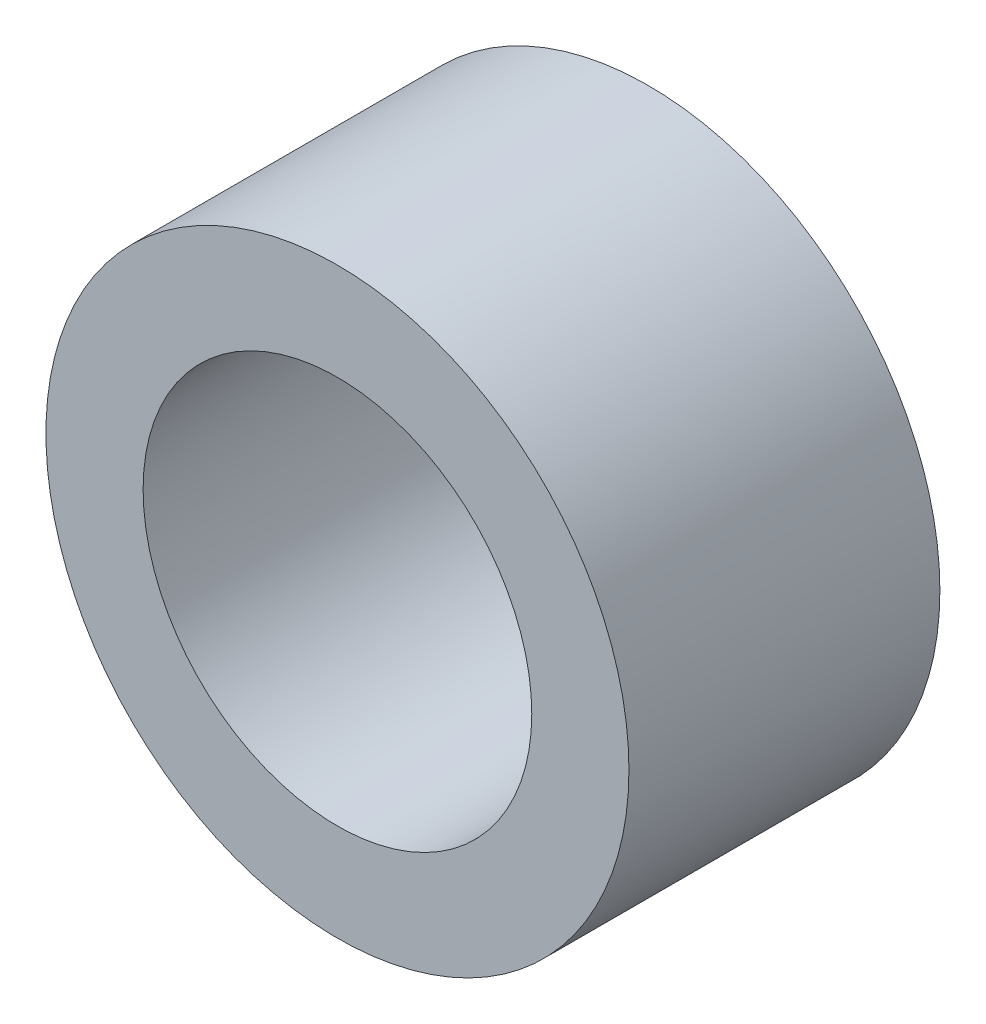
ISO-10303-21;
HEADER;
FILE_DESCRIPTION(('STEP AP214'),'2;1');
FILE_NAME('part.step','',(''),(''),'','','');
FILE_SCHEMA(('AUTOMOTIVE_DESIGN { 1 0 10303 214 1 1 1 1 }'));
ENDSEC;
DATA;
#1=APPLICATION_CONTEXT('core data for automotive mechanical design processes');
#2=APPLICATION_PROTOCOL_DEFINITION('international standard','automotive_design',2000,#1);
#3=PRODUCT_CONTEXT('',#1,'mechanical');
#4=PRODUCT('Part','Part','',(#3));
#5=PRODUCT_RELATED_PRODUCT_CATEGORY('part','',(#4));
#6=PRODUCT_DEFINITION_FORMATION('','',#4);
#7=PRODUCT_DEFINITION_CONTEXT('part definition',#1,'design');
#8=PRODUCT_DEFINITION('design','',#6,#7);
#9=PRODUCT_DEFINITION_SHAPE('','',#8);
#10=(LENGTH_UNIT() NAMED_UNIT(*) SI_UNIT(.MILLI.,.METRE.));
#11=(NAMED_UNIT(*) PLANE_ANGLE_UNIT() SI_UNIT($,.RADIAN.));
#12=(NAMED_UNIT(*) SI_UNIT($,.STERADIAN.) SOLID_ANGLE_UNIT());
#13=UNCERTAINTY_MEASURE_WITH_UNIT(LENGTH_MEASURE(1.E-05),#10,'distance_accuracy_value','');
#14=(GEOMETRIC_REPRESENTATION_CONTEXT(3) GLOBAL_UNCERTAINTY_ASSIGNED_CONTEXT((#13)) GLOBAL_UNIT_ASSIGNED_CONTEXT((#10,
#11,#12)) REPRESENTATION_CONTEXT('',''));
#15=CARTESIAN_POINT('',(0.,0.,0.));
#16=DIRECTION('',(0.,0.,1.));
#17=DIRECTION('',(1.,0.,0.));
#18=AXIS2_PLACEMENT_3D('',#15,#16,#17);
#19=CARTESIAN_POINT('',(0.,0.,16.));
#20=DIRECTION('',(0.,0.,1.));
#21=DIRECTION('',(1.,0.,0.));
#22=AXIS2_PLACEMENT_3D('',#19,#20,#21);
#23=PLANE('',#22);
#24=CARTESIAN_POINT('',(0.,0.,16.));
#25=DIRECTION('',(0.,0.,1.));
#26=DIRECTION('',(1.,0.,0.));
#27=AXIS2_PLACEMENT_3D('',#24,#25,#26);
#28=CIRCLE('',#27,30.);
#29=CARTESIAN_POINT('',(30.,0.,16.));
#30=VERTEX_POINT('',#29);
#31=EDGE_CURVE('E10',#30,#30,#28,.T.);
#32=ORIENTED_EDGE('',*,*,#31,.T.);
#33=EDGE_LOOP('',(#32));
#34=FACE_BOUND('',#33,.T.);
#35=CARTESIAN_POINT('',(0.,0.,16.));
#36=DIRECTION('',(0.,0.,1.));
#37=DIRECTION('',(1.,0.,0.));
#38=AXIS2_PLACEMENT_3D('',#35,#36,#37);
#39=CIRCLE('',#38,20.);
#40=CARTESIAN_POINT('',(20.,0.,16.));
#41=VERTEX_POINT('',#40);
#42=EDGE_CURVE('E42',#41,#41,#39,.T.);
#43=ORIENTED_EDGE('',*,*,#42,.F.);
#44=EDGE_LOOP('',(#43));
#45=FACE_BOUND('',#44,.T.);
#46=ADVANCED_FACE('F31',(#34,#45),#23,.T.);
#47=CARTESIAN_POINT('',(0.,0.,-16.));
#48=DIRECTION('',(0.,0.,1.));
#49=DIRECTION('',(1.,0.,0.));
#50=AXIS2_PLACEMENT_3D('',#47,#48,#49);
#51=PLANE('',#50);
#52=CARTESIAN_POINT('',(0.,0.,-16.));
#53=DIRECTION('',(0.,0.,1.));
#54=DIRECTION('',(1.,0.,0.));
#55=AXIS2_PLACEMENT_3D('',#52,#53,#54);
#56=CIRCLE('',#55,30.);
#57=CARTESIAN_POINT('',(30.,0.,-16.));
#58=VERTEX_POINT('',#57);
#59=EDGE_CURVE('E35',#58,#58,#56,.T.);
#60=ORIENTED_EDGE('',*,*,#59,.F.);
#61=EDGE_LOOP('',(#60));
#62=FACE_BOUND('',#61,.T.);
#63=CARTESIAN_POINT('',(0.,0.,-16.));
#64=DIRECTION('',(0.,0.,1.));
#65=DIRECTION('',(1.,0.,0.));
#66=AXIS2_PLACEMENT_3D('',#63,#64,#65);
#67=CIRCLE('',#66,20.);
#68=CARTESIAN_POINT('',(20.,0.,-16.));
#69=VERTEX_POINT('',#68);
#70=EDGE_CURVE('E44',#69,#69,#67,.T.);
#71=ORIENTED_EDGE('',*,*,#70,.T.);
#72=EDGE_LOOP('',(#71));
#73=FACE_BOUND('',#72,.T.);
#74=ADVANCED_FACE('F54',(#62,#73),#51,.F.);
#75=CARTESIAN_POINT('',(0.,0.,16.));
#76=DIRECTION('',(0.,0.,-1.));
#77=DIRECTION('',(-1.,0.,0.));
#78=AXIS2_PLACEMENT_3D('',#75,#76,#77);
#79=CYLINDRICAL_SURFACE('',#78,30.);
#80=ORIENTED_EDGE('',*,*,#31,.F.);
#81=EDGE_LOOP('',(#80));
#82=FACE_BOUND('',#81,.T.);
#83=ORIENTED_EDGE('',*,*,#59,.T.);
#84=EDGE_LOOP('',(#83));
#85=FACE_BOUND('',#84,.T.);
#86=ADVANCED_FACE('F33',(#82,#85),#79,.T.);
#87=CARTESIAN_POINT('',(0.,0.,16.));
#88=DIRECTION('',(0.,0.,-1.));
#89=DIRECTION('',(-1.,0.,0.));
#90=AXIS2_PLACEMENT_3D('',#87,#88,#89);
#91=CYLINDRICAL_SURFACE('',#90,20.);
#92=ORIENTED_EDGE('',*,*,#42,.T.);
#93=EDGE_LOOP('',(#92));
#94=FACE_BOUND('',#93,.T.);
#95=ORIENTED_EDGE('',*,*,#70,.F.);
#96=EDGE_LOOP('',(#95));
#97=FACE_BOUND('',#96,.T.);
#98=ADVANCED_FACE('F50',(#94,#97),#91,.F.);
#99=CLOSED_SHELL('',(#46,#74,#86,#98));
#100=MANIFOLD_SOLID_BREP('B2',#99);
#101=ADVANCED_BREP_SHAPE_REPRESENTATION('',(#18,#100),#14);
#102=SHAPE_DEFINITION_REPRESENTATION(#9,#101);
ENDSEC;
END-ISO-10303-21;
